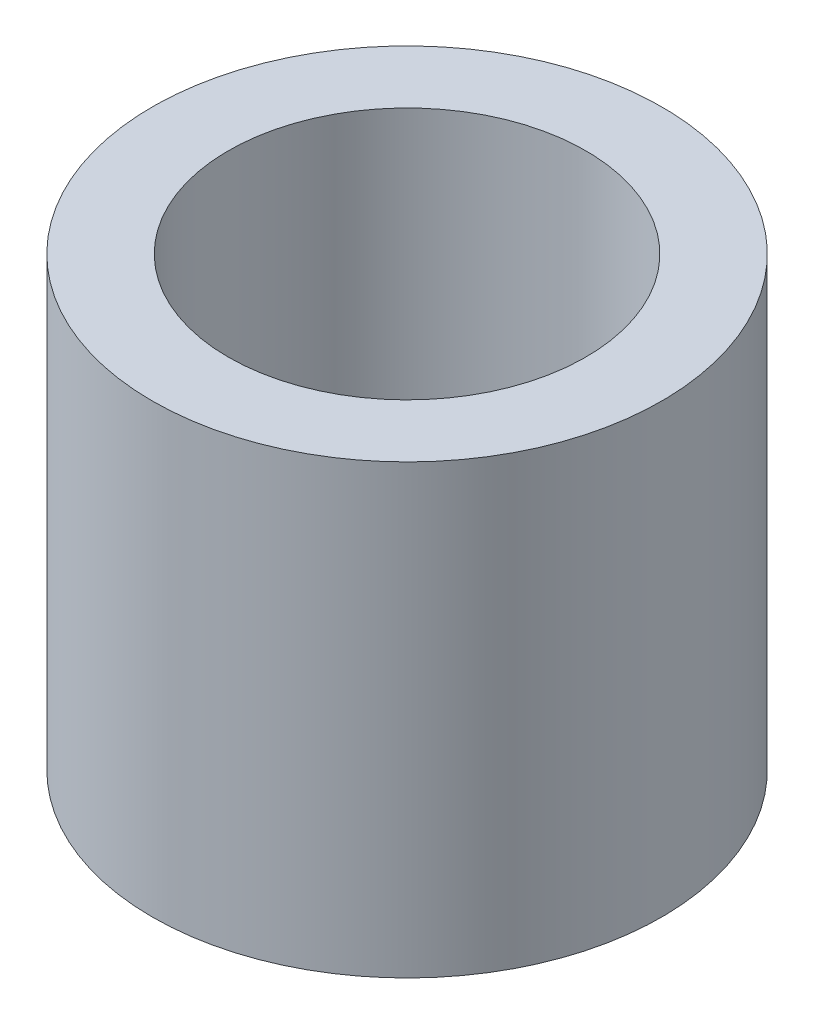
ISO-10303-21;
HEADER;
FILE_DESCRIPTION(('STEP AP214'),'2;1');
FILE_NAME('part.step','',(''),(''),'','','');
FILE_SCHEMA(('AUTOMOTIVE_DESIGN { 1 0 10303 214 1 1 1 1 }'));
ENDSEC;
DATA;
#1=APPLICATION_CONTEXT('core data for automotive mechanical design processes');
#2=APPLICATION_PROTOCOL_DEFINITION('international standard','automotive_design',2000,#1);
#3=PRODUCT_CONTEXT('',#1,'mechanical');
#4=PRODUCT('Part','Part','',(#3));
#5=PRODUCT_RELATED_PRODUCT_CATEGORY('part','',(#4));
#6=PRODUCT_DEFINITION_FORMATION('','',#4);
#7=PRODUCT_DEFINITION_CONTEXT('part definition',#1,'design');
#8=PRODUCT_DEFINITION('design','',#6,#7);
#9=PRODUCT_DEFINITION_SHAPE('','',#8);
#10=(LENGTH_UNIT() NAMED_UNIT(*) SI_UNIT(.MILLI.,.METRE.));
#11=(NAMED_UNIT(*) PLANE_ANGLE_UNIT() SI_UNIT($,.RADIAN.));
#12=(NAMED_UNIT(*) SI_UNIT($,.STERADIAN.) SOLID_ANGLE_UNIT());
#13=UNCERTAINTY_MEASURE_WITH_UNIT(LENGTH_MEASURE(1.E-05),#10,'distance_accuracy_value','');
#14=(GEOMETRIC_REPRESENTATION_CONTEXT(3) GLOBAL_UNCERTAINTY_ASSIGNED_CONTEXT((#13)) GLOBAL_UNIT_ASSIGNED_CONTEXT((#10,
#11,#12)) REPRESENTATION_CONTEXT('',''));
#15=CARTESIAN_POINT('',(0.,0.,0.));
#16=DIRECTION('',(0.,0.,1.));
#17=DIRECTION('',(1.,0.,0.));
#18=AXIS2_PLACEMENT_3D('',#15,#16,#17);
#19=CARTESIAN_POINT('',(0.,10.,0.));
#20=DIRECTION('',(0.,1.,0.));
#21=DIRECTION('',(0.,0.,1.));
#22=AXIS2_PLACEMENT_3D('',#19,#20,#21);
#23=PLANE('',#22);
#24=CARTESIAN_POINT('',(0.,10.,0.));
#25=DIRECTION('',(0.,1.,0.));
#26=DIRECTION('',(0.,0.,1.));
#27=AXIS2_PLACEMENT_3D('',#24,#25,#26);
#28=CIRCLE('',#27,5.7);
#29=CARTESIAN_POINT('',(0.,10.,5.7));
#30=VERTEX_POINT('',#29);
#31=EDGE_CURVE('E10',#30,#30,#28,.T.);
#32=ORIENTED_EDGE('',*,*,#31,.T.);
#33=EDGE_LOOP('',(#32));
#34=FACE_BOUND('',#33,.T.);
#35=CARTESIAN_POINT('',(0.,10.,0.));
#36=DIRECTION('',(0.,1.,0.));
#37=DIRECTION('',(0.,0.,1.));
#38=AXIS2_PLACEMENT_3D('',#35,#36,#37);
#39=CIRCLE('',#38,4.);
#40=CARTESIAN_POINT('',(0.,10.,4.));
#41=VERTEX_POINT('',#40);
#42=EDGE_CURVE('E46',#41,#41,#39,.T.);
#43=ORIENTED_EDGE('',*,*,#42,.F.);
#44=EDGE_LOOP('',(#43));
#45=FACE_BOUND('',#44,.T.);
#46=ADVANCED_FACE('F35',(#34,#45),#23,.T.);
#47=CARTESIAN_POINT('',(0.,0.,0.));
#48=DIRECTION('',(0.,1.,0.));
#49=DIRECTION('',(0.,0.,1.));
#50=AXIS2_PLACEMENT_3D('',#47,#48,#49);
#51=PLANE('',#50);
#52=CARTESIAN_POINT('',(0.,0.,0.));
#53=DIRECTION('',(0.,1.,0.));
#54=DIRECTION('',(0.,0.,1.));
#55=AXIS2_PLACEMENT_3D('',#52,#53,#54);
#56=CIRCLE('',#55,5.7);
#57=CARTESIAN_POINT('',(0.,0.,5.7));
#58=VERTEX_POINT('',#57);
#59=EDGE_CURVE('E39',#58,#58,#56,.T.);
#60=ORIENTED_EDGE('',*,*,#59,.F.);
#61=EDGE_LOOP('',(#60));
#62=FACE_BOUND('',#61,.T.);
#63=CARTESIAN_POINT('',(0.,0.,0.));
#64=DIRECTION('',(0.,1.,0.));
#65=DIRECTION('',(0.,0.,1.));
#66=AXIS2_PLACEMENT_3D('',#63,#64,#65);
#67=CIRCLE('',#66,4.);
#68=CARTESIAN_POINT('',(0.,0.,4.));
#69=VERTEX_POINT('',#68);
#70=EDGE_CURVE('E48',#69,#69,#67,.T.);
#71=ORIENTED_EDGE('',*,*,#70,.T.);
#72=EDGE_LOOP('',(#71));
#73=FACE_BOUND('',#72,.T.);
#74=ADVANCED_FACE('F58',(#62,#73),#51,.F.);
#75=CARTESIAN_POINT('',(0.,10.,0.));
#76=DIRECTION('',(0.,-1.,0.));
#77=DIRECTION('',(0.,0.,-1.));
#78=AXIS2_PLACEMENT_3D('',#75,#76,#77);
#79=CYLINDRICAL_SURFACE('',#78,5.7);
#80=ORIENTED_EDGE('',*,*,#31,.F.);
#81=EDGE_LOOP('',(#80));
#82=FACE_BOUND('',#81,.T.);
#83=ORIENTED_EDGE('',*,*,#59,.T.);
#84=EDGE_LOOP('',(#83));
#85=FACE_BOUND('',#84,.T.);
#86=ADVANCED_FACE('F37',(#82,#85),#79,.T.);
#87=CARTESIAN_POINT('',(0.,10.,0.));
#88=DIRECTION('',(0.,-1.,0.));
#89=DIRECTION('',(0.,0.,-1.));
#90=AXIS2_PLACEMENT_3D('',#87,#88,#89);
#91=CYLINDRICAL_SURFACE('',#90,4.);
#92=ORIENTED_EDGE('',*,*,#42,.T.);
#93=EDGE_LOOP('',(#92));
#94=FACE_BOUND('',#93,.T.);
#95=ORIENTED_EDGE('',*,*,#70,.F.);
#96=EDGE_LOOP('',(#95));
#97=FACE_BOUND('',#96,.T.);
#98=ADVANCED_FACE('F54',(#94,#97),#91,.F.);
#99=CLOSED_SHELL('',(#46,#74,#86,#98));
#100=MANIFOLD_SOLID_BREP('B2',#99);
#101=ADVANCED_BREP_SHAPE_REPRESENTATION('',(#18,#100),#14);
#102=SHAPE_DEFINITION_REPRESENTATION(#9,#101);
ENDSEC;
END-ISO-10303-21;
